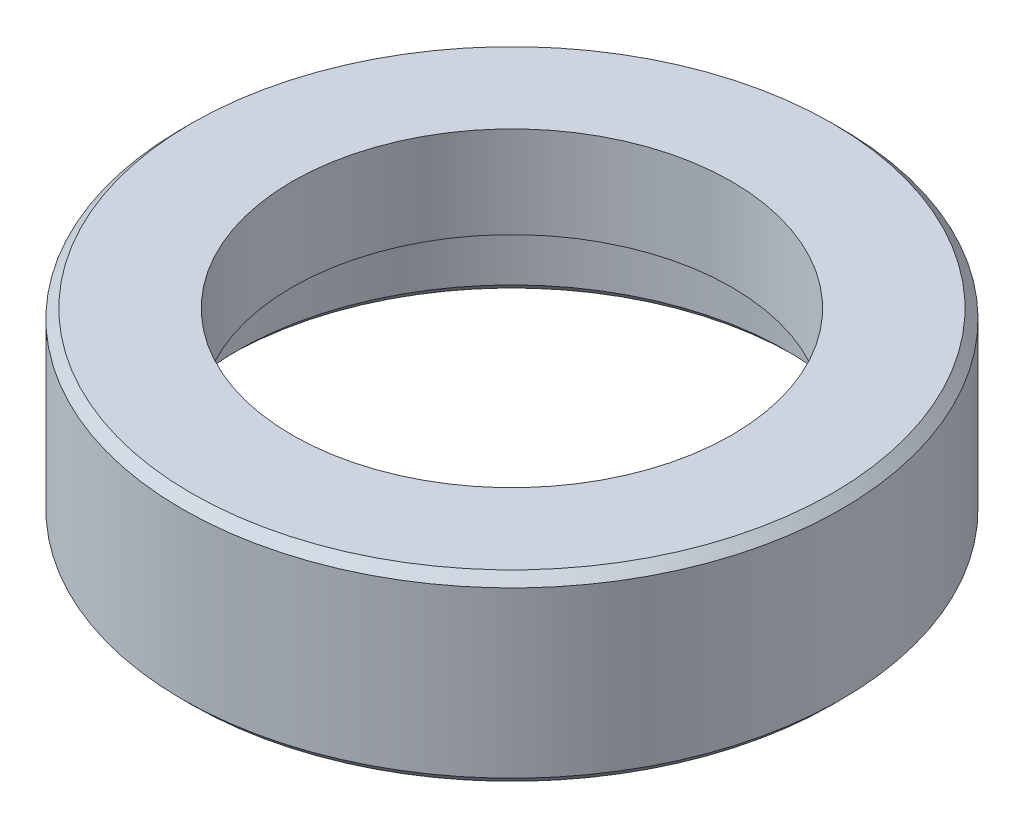
ISO-10303-21;
HEADER;
FILE_DESCRIPTION(('STEP AP214'),'2;1');
FILE_NAME('part.step','',(''),(''),'','','');
FILE_SCHEMA(('AUTOMOTIVE_DESIGN { 1 0 10303 214 1 1 1 1 }'));
ENDSEC;
DATA;
#1=APPLICATION_CONTEXT('core data for automotive mechanical design processes');
#2=APPLICATION_PROTOCOL_DEFINITION('international standard','automotive_design',2000,#1);
#3=PRODUCT_CONTEXT('',#1,'mechanical');
#4=PRODUCT('Part','Part','',(#3));
#5=PRODUCT_RELATED_PRODUCT_CATEGORY('part','',(#4));
#6=PRODUCT_DEFINITION_FORMATION('','',#4);
#7=PRODUCT_DEFINITION_CONTEXT('part definition',#1,'design');
#8=PRODUCT_DEFINITION('design','',#6,#7);
#9=PRODUCT_DEFINITION_SHAPE('','',#8);
#10=(LENGTH_UNIT() NAMED_UNIT(*) SI_UNIT(.MILLI.,.METRE.));
#11=(NAMED_UNIT(*) PLANE_ANGLE_UNIT() SI_UNIT($,.RADIAN.));
#12=(NAMED_UNIT(*) SI_UNIT($,.STERADIAN.) SOLID_ANGLE_UNIT());
#13=UNCERTAINTY_MEASURE_WITH_UNIT(LENGTH_MEASURE(1.E-05),#10,'distance_accuracy_value','');
#14=(GEOMETRIC_REPRESENTATION_CONTEXT(3) GLOBAL_UNCERTAINTY_ASSIGNED_CONTEXT((#13)) GLOBAL_UNIT_ASSIGNED_CONTEXT((#10,
#11,#12)) REPRESENTATION_CONTEXT('',''));
#15=CARTESIAN_POINT('',(0.,0.,0.));
#16=DIRECTION('',(0.,0.,1.));
#17=DIRECTION('',(1.,0.,0.));
#18=AXIS2_PLACEMENT_3D('',#15,#16,#17);
#19=CARTESIAN_POINT('',(0.,5.,0.));
#20=DIRECTION('',(0.,-1.,0.));
#21=DIRECTION('',(0.,0.,-1.));
#22=AXIS2_PLACEMENT_3D('',#19,#20,#21);
#23=CYLINDRICAL_SURFACE('',#22,9.);
#24=CARTESIAN_POINT('',(0.,0.249999999999997,0.));
#25=DIRECTION('',(0.,1.,0.));
#26=DIRECTION('',(0.,0.,1.));
#27=AXIS2_PLACEMENT_3D('',#24,#25,#26);
#28=CIRCLE('',#27,9.);
#29=CARTESIAN_POINT('',(0.,0.249999999999997,9.));
#30=VERTEX_POINT('',#29);
#31=EDGE_CURVE('E39',#30,#30,#28,.T.);
#32=ORIENTED_EDGE('',*,*,#31,.T.);
#33=EDGE_LOOP('',(#32));
#34=FACE_BOUND('',#33,.T.);
#35=CARTESIAN_POINT('',(0.,4.74999999999999,0.));
#36=DIRECTION('',(0.,1.,0.));
#37=DIRECTION('',(0.,0.,1.));
#38=AXIS2_PLACEMENT_3D('',#35,#36,#37);
#39=CIRCLE('',#38,9.);
#40=CARTESIAN_POINT('',(0.,4.74999999999999,9.));
#41=VERTEX_POINT('',#40);
#42=EDGE_CURVE('E43',#41,#41,#39,.F.);
#43=ORIENTED_EDGE('',*,*,#42,.T.);
#44=EDGE_LOOP('',(#43));
#45=FACE_BOUND('',#44,.T.);
#46=ADVANCED_FACE('F32',(#34,#45),#23,.T.);
#47=CARTESIAN_POINT('',(0.,5.,0.));
#48=DIRECTION('',(0.,1.,0.));
#49=DIRECTION('',(0.,0.,1.));
#50=AXIS2_PLACEMENT_3D('',#47,#48,#49);
#51=PLANE('',#50);
#52=CARTESIAN_POINT('',(0.,5.,0.));
#53=DIRECTION('',(0.,1.,0.));
#54=DIRECTION('',(0.,0.,1.));
#55=AXIS2_PLACEMENT_3D('',#52,#53,#54);
#56=CIRCLE('',#55,8.75);
#57=CARTESIAN_POINT('',(0.,5.,8.75));
#58=VERTEX_POINT('',#57);
#59=EDGE_CURVE('E10',#58,#58,#56,.T.);
#60=ORIENTED_EDGE('',*,*,#59,.T.);
#61=EDGE_LOOP('',(#60));
#62=FACE_BOUND('',#61,.T.);
#63=CARTESIAN_POINT('',(0.,5.,0.));
#64=DIRECTION('',(0.,1.,0.));
#65=DIRECTION('',(0.,0.,1.));
#66=AXIS2_PLACEMENT_3D('',#63,#64,#65);
#67=CIRCLE('',#66,6.);
#68=CARTESIAN_POINT('',(0.,5.,6.));
#69=VERTEX_POINT('',#68);
#70=EDGE_CURVE('E58',#69,#69,#67,.T.);
#71=ORIENTED_EDGE('',*,*,#70,.F.);
#72=EDGE_LOOP('',(#71));
#73=FACE_BOUND('',#72,.T.);
#74=ADVANCED_FACE('F79',(#62,#73),#51,.T.);
#75=CARTESIAN_POINT('',(0.,0.,0.));
#76=DIRECTION('',(0.,1.,0.));
#77=DIRECTION('',(0.,0.,1.));
#78=AXIS2_PLACEMENT_3D('',#75,#76,#77);
#79=PLANE('',#78);
#80=CARTESIAN_POINT('',(0.,0.,0.));
#81=DIRECTION('',(0.,1.,0.));
#82=DIRECTION('',(0.,0.,1.));
#83=AXIS2_PLACEMENT_3D('',#80,#81,#82);
#84=CIRCLE('',#83,7.75);
#85=CARTESIAN_POINT('',(0.,0.,7.75));
#86=VERTEX_POINT('',#85);
#87=EDGE_CURVE('E52',#86,#86,#84,.T.);
#88=ORIENTED_EDGE('',*,*,#87,.T.);
#89=EDGE_LOOP('',(#88));
#90=FACE_BOUND('',#89,.T.);
#91=CARTESIAN_POINT('',(0.,0.,0.));
#92=DIRECTION('',(0.,1.,0.));
#93=DIRECTION('',(0.,0.,1.));
#94=AXIS2_PLACEMENT_3D('',#91,#92,#93);
#95=CIRCLE('',#94,8.75);
#96=CARTESIAN_POINT('',(0.,0.,8.75));
#97=VERTEX_POINT('',#96);
#98=EDGE_CURVE('E55',#97,#97,#95,.F.);
#99=ORIENTED_EDGE('',*,*,#98,.T.);
#100=EDGE_LOOP('',(#99));
#101=FACE_BOUND('',#100,.T.);
#102=ADVANCED_FACE('F75',(#90,#101),#79,.F.);
#103=CARTESIAN_POINT('',(0.,21.9705627484771,0.));
#104=DIRECTION('',(0.,-1.,0.));
#105=DIRECTION('',(0.,0.,-1.));
#106=AXIS2_PLACEMENT_3D('',#103,#104,#105);
#107=CYLINDRICAL_SURFACE('',#106,6.);
#108=CARTESIAN_POINT('',(0.,2.5,0.));
#109=DIRECTION('',(0.,1.,0.));
#110=DIRECTION('',(0.,0.,1.));
#111=AXIS2_PLACEMENT_3D('',#108,#109,#110);
#112=CIRCLE('',#111,6.);
#113=CARTESIAN_POINT('',(0.,2.5,6.));
#114=VERTEX_POINT('',#113);
#115=EDGE_CURVE('E64',#114,#114,#112,.T.);
#116=ORIENTED_EDGE('',*,*,#115,.F.);
#117=EDGE_LOOP('',(#116));
#118=FACE_BOUND('',#117,.T.);
#119=ORIENTED_EDGE('',*,*,#70,.T.);
#120=EDGE_LOOP('',(#119));
#121=FACE_BOUND('',#120,.T.);
#122=ADVANCED_FACE('F71',(#118,#121),#107,.F.);
#123=CARTESIAN_POINT('',(0.,2.5,0.));
#124=DIRECTION('',(0.,-1.,0.));
#125=DIRECTION('',(0.,0.,-1.));
#126=AXIS2_PLACEMENT_3D('',#123,#124,#125);
#127=CYLINDRICAL_SURFACE('',#126,7.5);
#128=CARTESIAN_POINT('',(0.,0.250000000000002,0.));
#129=DIRECTION('',(0.,1.,0.));
#130=DIRECTION('',(0.,0.,1.));
#131=AXIS2_PLACEMENT_3D('',#128,#129,#130);
#132=CIRCLE('',#131,7.5);
#133=CARTESIAN_POINT('',(0.,0.250000000000002,7.5));
#134=VERTEX_POINT('',#133);
#135=EDGE_CURVE('E47',#134,#134,#132,.F.);
#136=ORIENTED_EDGE('',*,*,#135,.T.);
#137=EDGE_LOOP('',(#136));
#138=FACE_BOUND('',#137,.T.);
#139=CARTESIAN_POINT('',(0.,2.5,0.));
#140=DIRECTION('',(0.,1.,0.));
#141=DIRECTION('',(0.,0.,1.));
#142=AXIS2_PLACEMENT_3D('',#139,#140,#141);
#143=CIRCLE('',#142,7.5);
#144=CARTESIAN_POINT('',(0.,2.5,7.5));
#145=VERTEX_POINT('',#144);
#146=EDGE_CURVE('E61',#145,#145,#143,.T.);
#147=ORIENTED_EDGE('',*,*,#146,.T.);
#148=EDGE_LOOP('',(#147));
#149=FACE_BOUND('',#148,.T.);
#150=ADVANCED_FACE('F74',(#138,#149),#127,.F.);
#151=CARTESIAN_POINT('',(0.,2.5,0.));
#152=DIRECTION('',(0.,1.,0.));
#153=DIRECTION('',(0.,0.,1.));
#154=AXIS2_PLACEMENT_3D('',#151,#152,#153);
#155=PLANE('',#154);
#156=ORIENTED_EDGE('',*,*,#115,.T.);
#157=EDGE_LOOP('',(#156));
#158=FACE_BOUND('',#157,.T.);
#159=ORIENTED_EDGE('',*,*,#146,.F.);
#160=EDGE_LOOP('',(#159));
#161=FACE_BOUND('',#160,.T.);
#162=ADVANCED_FACE('F68',(#158,#161),#155,.F.);
#163=CARTESIAN_POINT('',(0.,0.,0.));
#164=DIRECTION('',(0.,-1.,0.));
#165=DIRECTION('',(0.,0.,-1.));
#166=AXIS2_PLACEMENT_3D('',#163,#164,#165);
#167=CONICAL_SURFACE('',#166,7.75,0.785398163397443);
#168=ORIENTED_EDGE('',*,*,#135,.F.);
#169=EDGE_LOOP('',(#168));
#170=FACE_BOUND('',#169,.T.);
#171=ORIENTED_EDGE('',*,*,#87,.F.);
#172=EDGE_LOOP('',(#171));
#173=FACE_BOUND('',#172,.T.);
#174=ADVANCED_FACE('F91',(#170,#173),#167,.F.);
#175=CARTESIAN_POINT('',(0.,0.249999999999997,0.));
#176=DIRECTION('',(0.,1.,0.));
#177=DIRECTION('',(0.,0.,1.));
#178=AXIS2_PLACEMENT_3D('',#175,#176,#177);
#179=CONICAL_SURFACE('',#178,9.,0.785398163397448);
#180=ORIENTED_EDGE('',*,*,#98,.F.);
#181=EDGE_LOOP('',(#180));
#182=FACE_BOUND('',#181,.T.);
#183=ORIENTED_EDGE('',*,*,#31,.F.);
#184=EDGE_LOOP('',(#183));
#185=FACE_BOUND('',#184,.T.);
#186=ADVANCED_FACE('F93',(#182,#185),#179,.T.);
#187=CARTESIAN_POINT('',(0.,5.,0.));
#188=DIRECTION('',(0.,-1.,0.));
#189=DIRECTION('',(0.,0.,-1.));
#190=AXIS2_PLACEMENT_3D('',#187,#188,#189);
#191=CONICAL_SURFACE('',#190,8.75,0.785398163397441);
#192=ORIENTED_EDGE('',*,*,#42,.F.);
#193=EDGE_LOOP('',(#192));
#194=FACE_BOUND('',#193,.T.);
#195=ORIENTED_EDGE('',*,*,#59,.F.);
#196=EDGE_LOOP('',(#195));
#197=FACE_BOUND('',#196,.T.);
#198=ADVANCED_FACE('F34',(#194,#197),#191,.T.);
#199=CLOSED_SHELL('',(#46,#74,#102,#122,#150,#162,#174,#186,#198));
#200=MANIFOLD_SOLID_BREP('B2',#199);
#201=ADVANCED_BREP_SHAPE_REPRESENTATION('',(#18,#200),#14);
#202=SHAPE_DEFINITION_REPRESENTATION(#9,#201);
ENDSEC;
END-ISO-10303-21;
